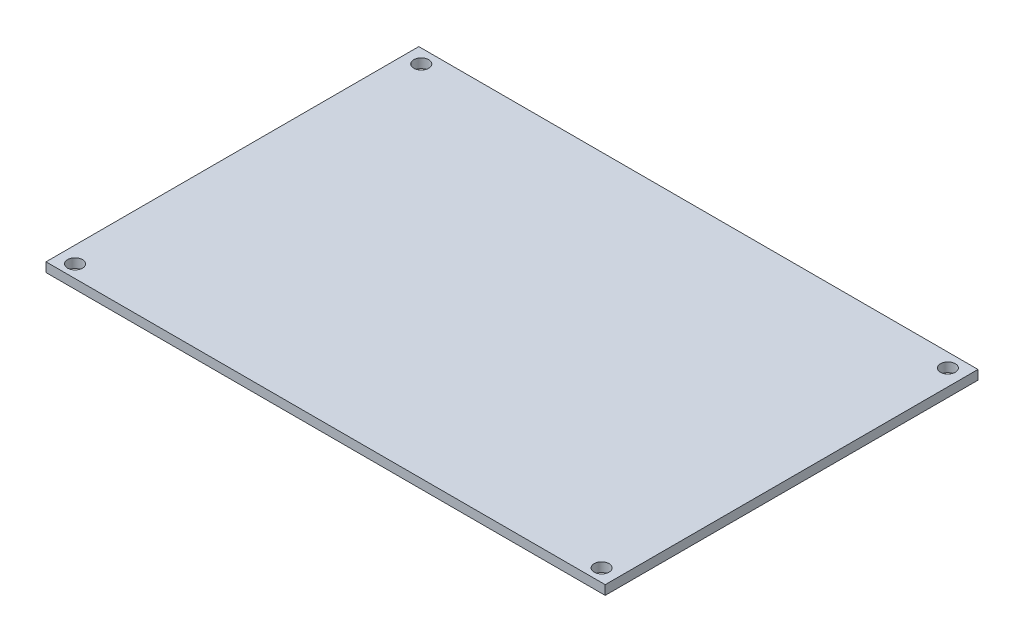
ISO-10303-21;
HEADER;
FILE_DESCRIPTION(('STEP AP214'),'2;1');
FILE_NAME('part.step','',(''),(''),'','','');
FILE_SCHEMA(('AUTOMOTIVE_DESIGN { 1 0 10303 214 1 1 1 1 }'));
ENDSEC;
DATA;
#1=APPLICATION_CONTEXT('core data for automotive mechanical design processes');
#2=APPLICATION_PROTOCOL_DEFINITION('international standard','automotive_design',2000,#1);
#3=PRODUCT_CONTEXT('',#1,'mechanical');
#4=PRODUCT('Part','Part','',(#3));
#5=PRODUCT_RELATED_PRODUCT_CATEGORY('part','',(#4));
#6=PRODUCT_DEFINITION_FORMATION('','',#4);
#7=PRODUCT_DEFINITION_CONTEXT('part definition',#1,'design');
#8=PRODUCT_DEFINITION('design','',#6,#7);
#9=PRODUCT_DEFINITION_SHAPE('','',#8);
#10=(LENGTH_UNIT() NAMED_UNIT(*) SI_UNIT(.MILLI.,.METRE.));
#11=(NAMED_UNIT(*) PLANE_ANGLE_UNIT() SI_UNIT($,.RADIAN.));
#12=(NAMED_UNIT(*) SI_UNIT($,.STERADIAN.) SOLID_ANGLE_UNIT());
#13=UNCERTAINTY_MEASURE_WITH_UNIT(LENGTH_MEASURE(1.E-05),#10,'distance_accuracy_value','');
#14=(GEOMETRIC_REPRESENTATION_CONTEXT(3) GLOBAL_UNCERTAINTY_ASSIGNED_CONTEXT((#13)) GLOBAL_UNIT_ASSIGNED_CONTEXT((#10,
#11,#12)) REPRESENTATION_CONTEXT('',''));
#15=CARTESIAN_POINT('',(0.,0.,0.));
#16=DIRECTION('',(0.,0.,1.));
#17=DIRECTION('',(1.,0.,0.));
#18=AXIS2_PLACEMENT_3D('',#15,#16,#17);
#19=CARTESIAN_POINT('',(-84.884178172838,2.,-82.281040328674));
#20=DIRECTION('',(1.,0.,0.));
#21=DIRECTION('',(0.,0.,-1.));
#22=AXIS2_PLACEMENT_3D('',#19,#20,#21);
#23=PLANE('',#22);
#24=DIRECTION('',(0.,0.,1.));
#25=VECTOR('',#24,1.);
#26=CARTESIAN_POINT('',(-84.884178172838,0.,-82.281040328674));
#27=LINE('',#26,#25);
#28=CARTESIAN_POINT('',(-84.884178172838,0.,-82.281040328674));
#29=VERTEX_POINT('',#28);
#30=CARTESIAN_POINT('',(-84.884178172838,0.,-2.28104032867402));
#31=VERTEX_POINT('',#30);
#32=EDGE_CURVE('E106',#29,#31,#27,.T.);
#33=ORIENTED_EDGE('',*,*,#32,.T.);
#34=DIRECTION('',(0.,-1.,0.));
#35=VECTOR('',#34,1.);
#36=CARTESIAN_POINT('',(-84.884178172838,2.,-2.28104032867402));
#37=LINE('',#36,#35);
#38=CARTESIAN_POINT('',(-84.884178172838,2.,-2.28104032867402));
#39=VERTEX_POINT('',#38);
#40=EDGE_CURVE('E11',#39,#31,#37,.T.);
#41=ORIENTED_EDGE('',*,*,#40,.F.);
#42=DIRECTION('',(0.,0.,1.));
#43=VECTOR('',#42,1.);
#44=CARTESIAN_POINT('',(-84.884178172838,2.,-82.281040328674));
#45=LINE('',#44,#43);
#46=CARTESIAN_POINT('',(-84.884178172838,2.,-82.281040328674));
#47=VERTEX_POINT('',#46);
#48=EDGE_CURVE('E91',#47,#39,#45,.T.);
#49=ORIENTED_EDGE('',*,*,#48,.F.);
#50=DIRECTION('',(0.,-1.,0.));
#51=VECTOR('',#50,1.);
#52=CARTESIAN_POINT('',(-84.884178172838,2.,-82.281040328674));
#53=LINE('',#52,#51);
#54=EDGE_CURVE('E105',#47,#29,#53,.T.);
#55=ORIENTED_EDGE('',*,*,#54,.T.);
#56=EDGE_LOOP('',(#33,#41,#49,#55));
#57=FACE_BOUND('',#56,.T.);
#58=ADVANCED_FACE('F37',(#57),#23,.F.);
#59=CARTESIAN_POINT('',(-84.884178172838,2.,-2.28104032867402));
#60=DIRECTION('',(0.,0.,-1.));
#61=DIRECTION('',(-1.,0.,0.));
#62=AXIS2_PLACEMENT_3D('',#59,#60,#61);
#63=PLANE('',#62);
#64=DIRECTION('',(1.,0.,0.));
#65=VECTOR('',#64,1.);
#66=CARTESIAN_POINT('',(-84.884178172838,0.,-2.28104032867402));
#67=LINE('',#66,#65);
#68=CARTESIAN_POINT('',(35.115821827162,0.,-2.28104032867402));
#69=VERTEX_POINT('',#68);
#70=EDGE_CURVE('E100',#31,#69,#67,.T.);
#71=ORIENTED_EDGE('',*,*,#70,.T.);
#72=DIRECTION('',(0.,-1.,0.));
#73=VECTOR('',#72,1.);
#74=CARTESIAN_POINT('',(35.115821827162,2.,-2.28104032867402));
#75=LINE('',#74,#73);
#76=CARTESIAN_POINT('',(35.115821827162,2.,-2.28104032867402));
#77=VERTEX_POINT('',#76);
#78=EDGE_CURVE('E47',#77,#69,#75,.T.);
#79=ORIENTED_EDGE('',*,*,#78,.F.);
#80=DIRECTION('',(1.,0.,0.));
#81=VECTOR('',#80,1.);
#82=CARTESIAN_POINT('',(-84.884178172838,2.,-2.28104032867402));
#83=LINE('',#82,#81);
#84=EDGE_CURVE('E86',#39,#77,#83,.T.);
#85=ORIENTED_EDGE('',*,*,#84,.F.);
#86=ORIENTED_EDGE('',*,*,#40,.T.);
#87=EDGE_LOOP('',(#71,#79,#85,#86));
#88=FACE_BOUND('',#87,.T.);
#89=ADVANCED_FACE('F96',(#88),#63,.F.);
#90=CARTESIAN_POINT('',(35.1158218271619,2.,-82.281040328674));
#91=DIRECTION('',(-1.,0.,0.));
#92=DIRECTION('',(0.,0.,1.));
#93=AXIS2_PLACEMENT_3D('',#90,#91,#92);
#94=PLANE('',#93);
#95=DIRECTION('',(0.,0.,-1.));
#96=VECTOR('',#95,1.);
#97=CARTESIAN_POINT('',(35.1158218271619,0.,-82.281040328674));
#98=LINE('',#97,#96);
#99=CARTESIAN_POINT('',(35.1158218271619,0.,-82.281040328674));
#100=VERTEX_POINT('',#99);
#101=EDGE_CURVE('E73',#69,#100,#98,.T.);
#102=ORIENTED_EDGE('',*,*,#101,.T.);
#103=DIRECTION('',(0.,-1.,0.));
#104=VECTOR('',#103,1.);
#105=CARTESIAN_POINT('',(35.1158218271619,2.,-82.281040328674));
#106=LINE('',#105,#104);
#107=CARTESIAN_POINT('',(35.1158218271619,2.,-82.281040328674));
#108=VERTEX_POINT('',#107);
#109=EDGE_CURVE('E98',#108,#100,#106,.T.);
#110=ORIENTED_EDGE('',*,*,#109,.F.);
#111=DIRECTION('',(0.,0.,-1.));
#112=VECTOR('',#111,1.);
#113=CARTESIAN_POINT('',(35.1158218271619,2.,-82.281040328674));
#114=LINE('',#113,#112);
#115=EDGE_CURVE('E93',#77,#108,#114,.T.);
#116=ORIENTED_EDGE('',*,*,#115,.F.);
#117=ORIENTED_EDGE('',*,*,#78,.T.);
#118=EDGE_LOOP('',(#102,#110,#116,#117));
#119=FACE_BOUND('',#118,.T.);
#120=ADVANCED_FACE('F99',(#119),#94,.F.);
#121=CARTESIAN_POINT('',(-84.884178172838,2.,-82.281040328674));
#122=DIRECTION('',(0.,0.,1.));
#123=DIRECTION('',(1.,0.,0.));
#124=AXIS2_PLACEMENT_3D('',#121,#122,#123);
#125=PLANE('',#124);
#126=DIRECTION('',(-1.,0.,0.));
#127=VECTOR('',#126,1.);
#128=CARTESIAN_POINT('',(-84.884178172838,0.,-82.281040328674));
#129=LINE('',#128,#127);
#130=EDGE_CURVE('E84',#100,#29,#129,.T.);
#131=ORIENTED_EDGE('',*,*,#130,.T.);
#132=ORIENTED_EDGE('',*,*,#54,.F.);
#133=DIRECTION('',(-1.,0.,0.));
#134=VECTOR('',#133,1.);
#135=CARTESIAN_POINT('',(-84.884178172838,2.,-82.281040328674));
#136=LINE('',#135,#134);
#137=EDGE_CURVE('E59',#108,#47,#136,.T.);
#138=ORIENTED_EDGE('',*,*,#137,.F.);
#139=ORIENTED_EDGE('',*,*,#109,.T.);
#140=EDGE_LOOP('',(#131,#132,#138,#139));
#141=FACE_BOUND('',#140,.T.);
#142=ADVANCED_FACE('F160',(#141),#125,.F.);
#143=CARTESIAN_POINT('',(0.,2.,0.));
#144=DIRECTION('',(0.,1.,0.));
#145=DIRECTION('',(0.,0.,1.));
#146=AXIS2_PLACEMENT_3D('',#143,#144,#145);
#147=PLANE('',#146);
#148=CARTESIAN_POINT('',(31.6128042465182,2.,-79.3134624321624));
#149=DIRECTION('',(0.,1.,0.));
#150=DIRECTION('',(0.,0.,1.));
#151=AXIS2_PLACEMENT_3D('',#148,#149,#150);
#152=CIRCLE('',#151,1.60000000000001);
#153=CARTESIAN_POINT('',(31.6128042465182,2.,-77.7134624321624));
#154=VERTEX_POINT('',#153);
#155=EDGE_CURVE('E228',#154,#154,#152,.T.);
#156=ORIENTED_EDGE('',*,*,#155,.F.);
#157=EDGE_LOOP('',(#156));
#158=FACE_BOUND('',#157,.T.);
#159=CARTESIAN_POINT('',(31.6128042465182,2.,-5.01346243216243));
#160=DIRECTION('',(0.,1.,0.));
#161=DIRECTION('',(0.,0.,1.));
#162=AXIS2_PLACEMENT_3D('',#159,#160,#161);
#163=CIRCLE('',#162,1.60000000000001);
#164=CARTESIAN_POINT('',(31.6128042465182,2.,-3.41346243216242));
#165=VERTEX_POINT('',#164);
#166=EDGE_CURVE('E222',#165,#165,#163,.T.);
#167=ORIENTED_EDGE('',*,*,#166,.F.);
#168=EDGE_LOOP('',(#167));
#169=FACE_BOUND('',#168,.T.);
#170=CARTESIAN_POINT('',(-81.3871957534818,2.,-5.01346243216243));
#171=DIRECTION('',(0.,1.,0.));
#172=DIRECTION('',(0.,0.,1.));
#173=AXIS2_PLACEMENT_3D('',#170,#171,#172);
#174=CIRCLE('',#173,1.60000000000001);
#175=CARTESIAN_POINT('',(-81.3871957534818,2.,-3.41346243216242));
#176=VERTEX_POINT('',#175);
#177=EDGE_CURVE('E212',#176,#176,#174,.T.);
#178=ORIENTED_EDGE('',*,*,#177,.F.);
#179=EDGE_LOOP('',(#178));
#180=FACE_BOUND('',#179,.T.);
#181=CARTESIAN_POINT('',(-81.3871957534818,2.,-79.3134624321624));
#182=DIRECTION('',(0.,1.,0.));
#183=DIRECTION('',(0.,0.,1.));
#184=AXIS2_PLACEMENT_3D('',#181,#182,#183);
#185=CIRCLE('',#184,1.60000000000001);
#186=CARTESIAN_POINT('',(-81.3871957534818,2.,-77.7134624321624));
#187=VERTEX_POINT('',#186);
#188=EDGE_CURVE('E117',#187,#187,#185,.T.);
#189=ORIENTED_EDGE('',*,*,#188,.F.);
#190=EDGE_LOOP('',(#189));
#191=FACE_BOUND('',#190,.T.);
#192=ORIENTED_EDGE('',*,*,#48,.T.);
#193=ORIENTED_EDGE('',*,*,#84,.T.);
#194=ORIENTED_EDGE('',*,*,#115,.T.);
#195=ORIENTED_EDGE('',*,*,#137,.T.);
#196=EDGE_LOOP('',(#192,#193,#194,#195));
#197=FACE_BOUND('',#196,.T.);
#198=ADVANCED_FACE('F90',(#158,#169,#180,#191,#197),#147,.T.);
#199=CARTESIAN_POINT('',(0.,0.,0.));
#200=DIRECTION('',(0.,1.,0.));
#201=DIRECTION('',(0.,0.,1.));
#202=AXIS2_PLACEMENT_3D('',#199,#200,#201);
#203=PLANE('',#202);
#204=CARTESIAN_POINT('',(31.6128042465182,0.,-79.3134624321624));
#205=DIRECTION('',(0.,1.,0.));
#206=DIRECTION('',(0.,0.,1.));
#207=AXIS2_PLACEMENT_3D('',#204,#205,#206);
#208=CIRCLE('',#207,1.60000000000001);
#209=CARTESIAN_POINT('',(31.6128042465182,0.,-77.7134624321624));
#210=VERTEX_POINT('',#209);
#211=EDGE_CURVE('E43',#210,#210,#208,.T.);
#212=ORIENTED_EDGE('',*,*,#211,.T.);
#213=EDGE_LOOP('',(#212));
#214=FACE_BOUND('',#213,.T.);
#215=CARTESIAN_POINT('',(31.6128042465182,0.,-5.01346243216243));
#216=DIRECTION('',(0.,1.,0.));
#217=DIRECTION('',(0.,0.,1.));
#218=AXIS2_PLACEMENT_3D('',#215,#216,#217);
#219=CIRCLE('',#218,1.60000000000001);
#220=CARTESIAN_POINT('',(31.6128042465182,0.,-3.41346243216242));
#221=VERTEX_POINT('',#220);
#222=EDGE_CURVE('E116',#221,#221,#219,.T.);
#223=ORIENTED_EDGE('',*,*,#222,.T.);
#224=EDGE_LOOP('',(#223));
#225=FACE_BOUND('',#224,.T.);
#226=CARTESIAN_POINT('',(-81.3871957534818,0.,-5.01346243216243));
#227=DIRECTION('',(0.,1.,0.));
#228=DIRECTION('',(0.,0.,1.));
#229=AXIS2_PLACEMENT_3D('',#226,#227,#228);
#230=CIRCLE('',#229,1.60000000000001);
#231=CARTESIAN_POINT('',(-81.3871957534818,0.,-3.41346243216242));
#232=VERTEX_POINT('',#231);
#233=EDGE_CURVE('E119',#232,#232,#230,.T.);
#234=ORIENTED_EDGE('',*,*,#233,.T.);
#235=EDGE_LOOP('',(#234));
#236=FACE_BOUND('',#235,.T.);
#237=CARTESIAN_POINT('',(-81.3871957534818,0.,-79.3134624321624));
#238=DIRECTION('',(0.,1.,0.));
#239=DIRECTION('',(0.,0.,1.));
#240=AXIS2_PLACEMENT_3D('',#237,#238,#239);
#241=CIRCLE('',#240,1.60000000000001);
#242=CARTESIAN_POINT('',(-81.3871957534818,0.,-77.7134624321624));
#243=VERTEX_POINT('',#242);
#244=EDGE_CURVE('E111',#243,#243,#241,.T.);
#245=ORIENTED_EDGE('',*,*,#244,.T.);
#246=EDGE_LOOP('',(#245));
#247=FACE_BOUND('',#246,.T.);
#248=ORIENTED_EDGE('',*,*,#32,.F.);
#249=ORIENTED_EDGE('',*,*,#130,.F.);
#250=ORIENTED_EDGE('',*,*,#101,.F.);
#251=ORIENTED_EDGE('',*,*,#70,.F.);
#252=EDGE_LOOP('',(#248,#249,#250,#251));
#253=FACE_BOUND('',#252,.T.);
#254=ADVANCED_FACE('F130',(#214,#225,#236,#247,#253),#203,.F.);
#255=CARTESIAN_POINT('',(-81.3871957534818,-8.,-79.3134624321624));
#256=DIRECTION('',(0.,1.,0.));
#257=DIRECTION('',(0.,0.,1.));
#258=AXIS2_PLACEMENT_3D('',#255,#256,#257);
#259=CYLINDRICAL_SURFACE('',#258,1.60000000000001);
#260=ORIENTED_EDGE('',*,*,#188,.T.);
#261=EDGE_LOOP('',(#260));
#262=FACE_BOUND('',#261,.T.);
#263=ORIENTED_EDGE('',*,*,#244,.F.);
#264=EDGE_LOOP('',(#263));
#265=FACE_BOUND('',#264,.T.);
#266=ADVANCED_FACE('F147',(#262,#265),#259,.F.);
#267=CARTESIAN_POINT('',(-81.3871957534818,-8.,-5.01346243216243));
#268=DIRECTION('',(0.,1.,0.));
#269=DIRECTION('',(0.,0.,1.));
#270=AXIS2_PLACEMENT_3D('',#267,#268,#269);
#271=CYLINDRICAL_SURFACE('',#270,1.60000000000001);
#272=ORIENTED_EDGE('',*,*,#177,.T.);
#273=EDGE_LOOP('',(#272));
#274=FACE_BOUND('',#273,.T.);
#275=ORIENTED_EDGE('',*,*,#233,.F.);
#276=EDGE_LOOP('',(#275));
#277=FACE_BOUND('',#276,.T.);
#278=ADVANCED_FACE('F136',(#274,#277),#271,.F.);
#279=CARTESIAN_POINT('',(31.6128042465182,-8.,-5.01346243216243));
#280=DIRECTION('',(0.,1.,0.));
#281=DIRECTION('',(0.,0.,1.));
#282=AXIS2_PLACEMENT_3D('',#279,#280,#281);
#283=CYLINDRICAL_SURFACE('',#282,1.60000000000001);
#284=ORIENTED_EDGE('',*,*,#166,.T.);
#285=EDGE_LOOP('',(#284));
#286=FACE_BOUND('',#285,.T.);
#287=ORIENTED_EDGE('',*,*,#222,.F.);
#288=EDGE_LOOP('',(#287));
#289=FACE_BOUND('',#288,.T.);
#290=ADVANCED_FACE('F133',(#286,#289),#283,.F.);
#291=CARTESIAN_POINT('',(31.6128042465182,-8.,-79.3134624321624));
#292=DIRECTION('',(0.,1.,0.));
#293=DIRECTION('',(0.,0.,1.));
#294=AXIS2_PLACEMENT_3D('',#291,#292,#293);
#295=CYLINDRICAL_SURFACE('',#294,1.60000000000001);
#296=ORIENTED_EDGE('',*,*,#155,.T.);
#297=EDGE_LOOP('',(#296));
#298=FACE_BOUND('',#297,.T.);
#299=ORIENTED_EDGE('',*,*,#211,.F.);
#300=EDGE_LOOP('',(#299));
#301=FACE_BOUND('',#300,.T.);
#302=ADVANCED_FACE('F129',(#298,#301),#295,.F.);
#303=CLOSED_SHELL('',(#58,#89,#120,#142,#198,#254,#266,#278,#290,#302));
#304=MANIFOLD_SOLID_BREP('B2',#303);
#305=ADVANCED_BREP_SHAPE_REPRESENTATION('',(#18,#304),#14);
#306=SHAPE_DEFINITION_REPRESENTATION(#9,#305);
ENDSEC;
END-ISO-10303-21;
